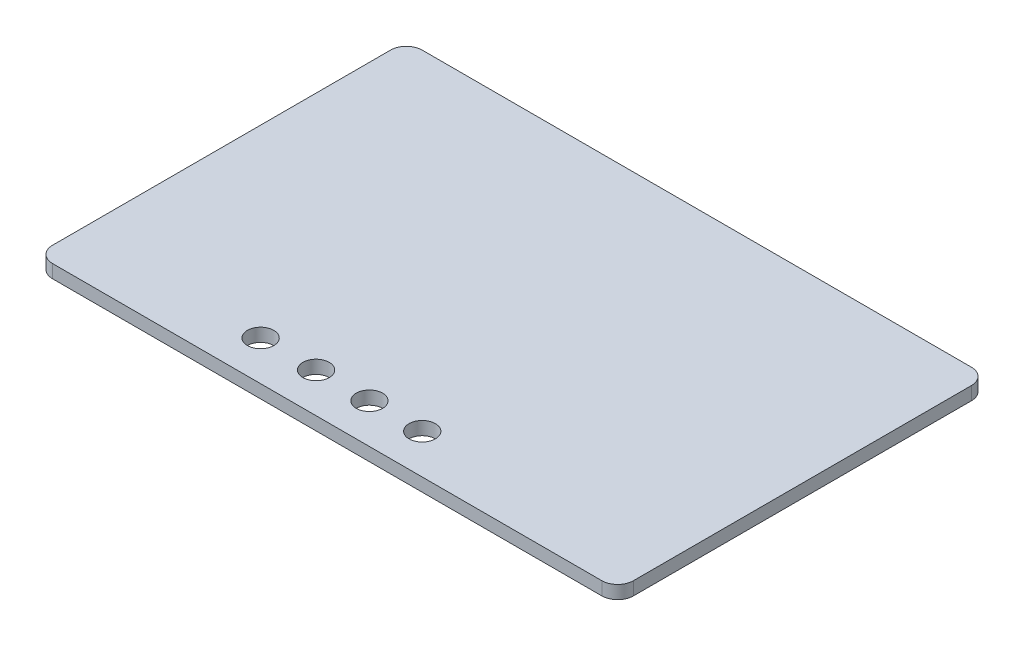
ISO-10303-21;
HEADER;
FILE_DESCRIPTION(('STEP AP214'),'2;1');
FILE_NAME('part.step','',(''),(''),'','','');
FILE_SCHEMA(('AUTOMOTIVE_DESIGN { 1 0 10303 214 1 1 1 1 }'));
ENDSEC;
DATA;
#1=APPLICATION_CONTEXT('core data for automotive mechanical design processes');
#2=APPLICATION_PROTOCOL_DEFINITION('international standard','automotive_design',2000,#1);
#3=PRODUCT_CONTEXT('',#1,'mechanical');
#4=PRODUCT('Part','Part','',(#3));
#5=PRODUCT_RELATED_PRODUCT_CATEGORY('part','',(#4));
#6=PRODUCT_DEFINITION_FORMATION('','',#4);
#7=PRODUCT_DEFINITION_CONTEXT('part definition',#1,'design');
#8=PRODUCT_DEFINITION('design','',#6,#7);
#9=PRODUCT_DEFINITION_SHAPE('','',#8);
#10=(LENGTH_UNIT() NAMED_UNIT(*) SI_UNIT(.MILLI.,.METRE.));
#11=(NAMED_UNIT(*) PLANE_ANGLE_UNIT() SI_UNIT($,.RADIAN.));
#12=(NAMED_UNIT(*) SI_UNIT($,.STERADIAN.) SOLID_ANGLE_UNIT());
#13=UNCERTAINTY_MEASURE_WITH_UNIT(LENGTH_MEASURE(1.E-05),#10,'distance_accuracy_value','');
#14=(GEOMETRIC_REPRESENTATION_CONTEXT(3) GLOBAL_UNCERTAINTY_ASSIGNED_CONTEXT((#13)) GLOBAL_UNIT_ASSIGNED_CONTEXT((#10,
#11,#12)) REPRESENTATION_CONTEXT('',''));
#15=CARTESIAN_POINT('',(0.,0.,0.));
#16=DIRECTION('',(0.,0.,1.));
#17=DIRECTION('',(1.,0.,0.));
#18=AXIS2_PLACEMENT_3D('',#15,#16,#17);
#19=CARTESIAN_POINT('',(-52.,-2.5,32.));
#20=DIRECTION('',(0.,1.,0.));
#21=DIRECTION('',(0.,0.,1.));
#22=AXIS2_PLACEMENT_3D('',#19,#20,#21);
#23=CYLINDRICAL_SURFACE('',#22,3.);
#24=CARTESIAN_POINT('',(-52.,-2.5,32.));
#25=DIRECTION('',(0.,-1.,0.));
#26=DIRECTION('',(0.,0.,-1.));
#27=AXIS2_PLACEMENT_3D('',#24,#25,#26);
#28=CIRCLE('',#27,3.);
#29=CARTESIAN_POINT('',(-55.,-2.5,32.));
#30=VERTEX_POINT('',#29);
#31=CARTESIAN_POINT('',(-52.,-2.5,35.));
#32=VERTEX_POINT('',#31);
#33=EDGE_CURVE('E265',#30,#32,#28,.F.);
#34=ORIENTED_EDGE('',*,*,#33,.T.);
#35=DIRECTION('',(0.,1.,0.));
#36=VECTOR('',#35,1.);
#37=CARTESIAN_POINT('',(-52.,-2.5,35.));
#38=LINE('',#37,#36);
#39=CARTESIAN_POINT('',(-52.,0.,35.));
#40=VERTEX_POINT('',#39);
#41=EDGE_CURVE('E225',#32,#40,#38,.T.);
#42=ORIENTED_EDGE('',*,*,#41,.T.);
#43=CARTESIAN_POINT('',(-52.,0.,32.));
#44=DIRECTION('',(0.,-1.,0.));
#45=DIRECTION('',(0.,0.,-1.));
#46=AXIS2_PLACEMENT_3D('',#43,#44,#45);
#47=CIRCLE('',#46,3.);
#48=CARTESIAN_POINT('',(-55.,0.,32.));
#49=VERTEX_POINT('',#48);
#50=EDGE_CURVE('E283',#40,#49,#47,.T.);
#51=ORIENTED_EDGE('',*,*,#50,.T.);
#52=DIRECTION('',(0.,1.,0.));
#53=VECTOR('',#52,1.);
#54=CARTESIAN_POINT('',(-55.,-2.5,32.));
#55=LINE('',#54,#53);
#56=EDGE_CURVE('E12',#30,#49,#55,.T.);
#57=ORIENTED_EDGE('',*,*,#56,.F.);
#58=EDGE_LOOP('',(#34,#42,#51,#57));
#59=FACE_BOUND('',#58,.T.);
#60=ADVANCED_FACE('F203',(#59),#23,.T.);
#61=CARTESIAN_POINT('',(-55.,-2.5,32.));
#62=DIRECTION('',(1.,0.,0.));
#63=DIRECTION('',(0.,0.,-1.));
#64=AXIS2_PLACEMENT_3D('',#61,#62,#63);
#65=PLANE('',#64);
#66=DIRECTION('',(0.,0.,1.));
#67=VECTOR('',#66,1.);
#68=CARTESIAN_POINT('',(-55.,-2.5,32.));
#69=LINE('',#68,#67);
#70=CARTESIAN_POINT('',(-55.,-2.5,-32.));
#71=VERTEX_POINT('',#70);
#72=EDGE_CURVE('E269',#71,#30,#69,.T.);
#73=ORIENTED_EDGE('',*,*,#72,.T.);
#74=ORIENTED_EDGE('',*,*,#56,.T.);
#75=DIRECTION('',(0.,0.,-1.));
#76=VECTOR('',#75,1.);
#77=CARTESIAN_POINT('',(-55.,0.,32.));
#78=LINE('',#77,#76);
#79=CARTESIAN_POINT('',(-55.,0.,-32.));
#80=VERTEX_POINT('',#79);
#81=EDGE_CURVE('E287',#49,#80,#78,.T.);
#82=ORIENTED_EDGE('',*,*,#81,.T.);
#83=DIRECTION('',(0.,1.,0.));
#84=VECTOR('',#83,1.);
#85=CARTESIAN_POINT('',(-55.,-2.5,-32.));
#86=LINE('',#85,#84);
#87=EDGE_CURVE('E210',#71,#80,#86,.T.);
#88=ORIENTED_EDGE('',*,*,#87,.F.);
#89=EDGE_LOOP('',(#73,#74,#82,#88));
#90=FACE_BOUND('',#89,.T.);
#91=ADVANCED_FACE('F277',(#90),#65,.F.);
#92=CARTESIAN_POINT('',(-52.,-2.5,-32.));
#93=DIRECTION('',(0.,1.,0.));
#94=DIRECTION('',(0.,0.,1.));
#95=AXIS2_PLACEMENT_3D('',#92,#93,#94);
#96=CYLINDRICAL_SURFACE('',#95,3.);
#97=CARTESIAN_POINT('',(-52.,-2.5,-32.));
#98=DIRECTION('',(0.,-1.,0.));
#99=DIRECTION('',(0.,0.,-1.));
#100=AXIS2_PLACEMENT_3D('',#97,#98,#99);
#101=CIRCLE('',#100,3.);
#102=CARTESIAN_POINT('',(-52.,-2.5,-35.));
#103=VERTEX_POINT('',#102);
#104=EDGE_CURVE('E280',#103,#71,#101,.F.);
#105=ORIENTED_EDGE('',*,*,#104,.T.);
#106=ORIENTED_EDGE('',*,*,#87,.T.);
#107=CARTESIAN_POINT('',(-52.,0.,-32.));
#108=DIRECTION('',(0.,-1.,0.));
#109=DIRECTION('',(0.,0.,-1.));
#110=AXIS2_PLACEMENT_3D('',#107,#108,#109);
#111=CIRCLE('',#110,3.);
#112=CARTESIAN_POINT('',(-52.,0.,-35.));
#113=VERTEX_POINT('',#112);
#114=EDGE_CURVE('E290',#80,#113,#111,.T.);
#115=ORIENTED_EDGE('',*,*,#114,.T.);
#116=DIRECTION('',(0.,1.,0.));
#117=VECTOR('',#116,1.);
#118=CARTESIAN_POINT('',(-52.,-2.5,-35.));
#119=LINE('',#118,#117);
#120=EDGE_CURVE('E323',#103,#113,#119,.T.);
#121=ORIENTED_EDGE('',*,*,#120,.F.);
#122=EDGE_LOOP('',(#105,#106,#115,#121));
#123=FACE_BOUND('',#122,.T.);
#124=ADVANCED_FACE('F325',(#123),#96,.T.);
#125=CARTESIAN_POINT('',(-52.,-2.5,-35.));
#126=DIRECTION('',(0.,0.,1.));
#127=DIRECTION('',(1.,0.,0.));
#128=AXIS2_PLACEMENT_3D('',#125,#126,#127);
#129=PLANE('',#128);
#130=DIRECTION('',(-1.,0.,0.));
#131=VECTOR('',#130,1.);
#132=CARTESIAN_POINT('',(-52.,-2.5,-35.));
#133=LINE('',#132,#131);
#134=CARTESIAN_POINT('',(52.,-2.5,-35.));
#135=VERTEX_POINT('',#134);
#136=EDGE_CURVE('E335',#135,#103,#133,.T.);
#137=ORIENTED_EDGE('',*,*,#136,.T.);
#138=ORIENTED_EDGE('',*,*,#120,.T.);
#139=DIRECTION('',(1.,0.,0.));
#140=VECTOR('',#139,1.);
#141=CARTESIAN_POINT('',(-52.,0.,-35.));
#142=LINE('',#141,#140);
#143=CARTESIAN_POINT('',(52.,0.,-35.));
#144=VERTEX_POINT('',#143);
#145=EDGE_CURVE('E300',#113,#144,#142,.T.);
#146=ORIENTED_EDGE('',*,*,#145,.T.);
#147=DIRECTION('',(0.,1.,0.));
#148=VECTOR('',#147,1.);
#149=CARTESIAN_POINT('',(52.,-2.5,-35.));
#150=LINE('',#149,#148);
#151=EDGE_CURVE('E321',#135,#144,#150,.T.);
#152=ORIENTED_EDGE('',*,*,#151,.F.);
#153=EDGE_LOOP('',(#137,#138,#146,#152));
#154=FACE_BOUND('',#153,.T.);
#155=ADVANCED_FACE('F334',(#154),#129,.F.);
#156=CARTESIAN_POINT('',(52.,-2.5,-32.));
#157=DIRECTION('',(0.,1.,0.));
#158=DIRECTION('',(0.,0.,1.));
#159=AXIS2_PLACEMENT_3D('',#156,#157,#158);
#160=CYLINDRICAL_SURFACE('',#159,3.);
#161=CARTESIAN_POINT('',(52.,-2.5,-32.));
#162=DIRECTION('',(0.,-1.,0.));
#163=DIRECTION('',(0.,0.,-1.));
#164=AXIS2_PLACEMENT_3D('',#161,#162,#163);
#165=CIRCLE('',#164,3.);
#166=CARTESIAN_POINT('',(55.,-2.5,-32.));
#167=VERTEX_POINT('',#166);
#168=EDGE_CURVE('E337',#167,#135,#165,.F.);
#169=ORIENTED_EDGE('',*,*,#168,.T.);
#170=ORIENTED_EDGE('',*,*,#151,.T.);
#171=CARTESIAN_POINT('',(52.,0.,-32.));
#172=DIRECTION('',(0.,-1.,0.));
#173=DIRECTION('',(0.,0.,-1.));
#174=AXIS2_PLACEMENT_3D('',#171,#172,#173);
#175=CIRCLE('',#174,3.);
#176=CARTESIAN_POINT('',(55.,0.,-32.));
#177=VERTEX_POINT('',#176);
#178=EDGE_CURVE('E303',#144,#177,#175,.T.);
#179=ORIENTED_EDGE('',*,*,#178,.T.);
#180=DIRECTION('',(0.,1.,0.));
#181=VECTOR('',#180,1.);
#182=CARTESIAN_POINT('',(55.,-2.5,-32.));
#183=LINE('',#182,#181);
#184=EDGE_CURVE('E319',#167,#177,#183,.T.);
#185=ORIENTED_EDGE('',*,*,#184,.F.);
#186=EDGE_LOOP('',(#169,#170,#179,#185));
#187=FACE_BOUND('',#186,.T.);
#188=ADVANCED_FACE('F396',(#187),#160,.T.);
#189=CARTESIAN_POINT('',(55.,-2.5,32.));
#190=DIRECTION('',(1.,0.,0.));
#191=DIRECTION('',(0.,0.,-1.));
#192=AXIS2_PLACEMENT_3D('',#189,#190,#191);
#193=PLANE('',#192);
#194=DIRECTION('',(0.,1.,0.));
#195=VECTOR('',#194,1.);
#196=CARTESIAN_POINT('',(55.,-2.5,32.));
#197=LINE('',#196,#195);
#198=CARTESIAN_POINT('',(55.,-2.5,32.));
#199=VERTEX_POINT('',#198);
#200=CARTESIAN_POINT('',(55.,0.,32.));
#201=VERTEX_POINT('',#200);
#202=EDGE_CURVE('E317',#199,#201,#197,.T.);
#203=ORIENTED_EDGE('',*,*,#202,.F.);
#204=DIRECTION('',(0.,0.,-1.));
#205=VECTOR('',#204,1.);
#206=CARTESIAN_POINT('',(55.,-2.5,-32.));
#207=LINE('',#206,#205);
#208=EDGE_CURVE('E339',#199,#167,#207,.T.);
#209=ORIENTED_EDGE('',*,*,#208,.T.);
#210=ORIENTED_EDGE('',*,*,#184,.T.);
#211=DIRECTION('',(0.,0.,-1.));
#212=VECTOR('',#211,1.);
#213=CARTESIAN_POINT('',(55.,0.,32.));
#214=LINE('',#213,#212);
#215=EDGE_CURVE('E306',#201,#177,#214,.T.);
#216=ORIENTED_EDGE('',*,*,#215,.F.);
#217=EDGE_LOOP('',(#203,#209,#210,#216));
#218=FACE_BOUND('',#217,.T.);
#219=ADVANCED_FACE('F399',(#218),#193,.T.);
#220=CARTESIAN_POINT('',(52.,-2.5,32.));
#221=DIRECTION('',(0.,1.,0.));
#222=DIRECTION('',(0.,0.,1.));
#223=AXIS2_PLACEMENT_3D('',#220,#221,#222);
#224=CYLINDRICAL_SURFACE('',#223,3.);
#225=DIRECTION('',(0.,1.,0.));
#226=VECTOR('',#225,1.);
#227=CARTESIAN_POINT('',(52.,-2.5,35.));
#228=LINE('',#227,#226);
#229=CARTESIAN_POINT('',(52.,-2.5,35.));
#230=VERTEX_POINT('',#229);
#231=CARTESIAN_POINT('',(52.,0.,35.));
#232=VERTEX_POINT('',#231);
#233=EDGE_CURVE('E315',#230,#232,#228,.T.);
#234=ORIENTED_EDGE('',*,*,#233,.F.);
#235=CARTESIAN_POINT('',(52.,-2.5,32.));
#236=DIRECTION('',(0.,-1.,0.));
#237=DIRECTION('',(0.,0.,-1.));
#238=AXIS2_PLACEMENT_3D('',#235,#236,#237);
#239=CIRCLE('',#238,3.);
#240=EDGE_CURVE('E217',#230,#199,#239,.F.);
#241=ORIENTED_EDGE('',*,*,#240,.T.);
#242=ORIENTED_EDGE('',*,*,#202,.T.);
#243=CARTESIAN_POINT('',(52.,0.,32.));
#244=DIRECTION('',(0.,1.,0.));
#245=DIRECTION('',(0.,0.,1.));
#246=AXIS2_PLACEMENT_3D('',#243,#244,#245);
#247=CIRCLE('',#246,3.);
#248=EDGE_CURVE('E309',#232,#201,#247,.T.);
#249=ORIENTED_EDGE('',*,*,#248,.F.);
#250=EDGE_LOOP('',(#234,#241,#242,#249));
#251=FACE_BOUND('',#250,.T.);
#252=ADVANCED_FACE('F379',(#251),#224,.T.);
#253=CARTESIAN_POINT('',(-52.,-2.5,35.));
#254=DIRECTION('',(0.,0.,1.));
#255=DIRECTION('',(1.,0.,0.));
#256=AXIS2_PLACEMENT_3D('',#253,#254,#255);
#257=PLANE('',#256);
#258=ORIENTED_EDGE('',*,*,#41,.F.);
#259=DIRECTION('',(1.,0.,0.));
#260=VECTOR('',#259,1.);
#261=CARTESIAN_POINT('',(52.,-2.5,35.));
#262=LINE('',#261,#260);
#263=EDGE_CURVE('E271',#32,#230,#262,.T.);
#264=ORIENTED_EDGE('',*,*,#263,.T.);
#265=ORIENTED_EDGE('',*,*,#233,.T.);
#266=DIRECTION('',(1.,0.,0.));
#267=VECTOR('',#266,1.);
#268=CARTESIAN_POINT('',(-52.,0.,35.));
#269=LINE('',#268,#267);
#270=EDGE_CURVE('E312',#40,#232,#269,.T.);
#271=ORIENTED_EDGE('',*,*,#270,.F.);
#272=EDGE_LOOP('',(#258,#264,#265,#271));
#273=FACE_BOUND('',#272,.T.);
#274=ADVANCED_FACE('F369',(#273),#257,.T.);
#275=CARTESIAN_POINT('',(-52.,0.,32.));
#276=DIRECTION('',(0.,-1.,0.));
#277=DIRECTION('',(0.,0.,-1.));
#278=AXIS2_PLACEMENT_3D('',#275,#276,#277);
#279=PLANE('',#278);
#280=CARTESIAN_POINT('',(-20.1,0.,27.5));
#281=DIRECTION('',(0.,1.,0.));
#282=DIRECTION('',(0.,0.,1.));
#283=AXIS2_PLACEMENT_3D('',#280,#281,#282);
#284=CIRCLE('',#283,2.49999999999999);
#285=CARTESIAN_POINT('',(-20.1,0.,30.));
#286=VERTEX_POINT('',#285);
#287=EDGE_CURVE('E288',#286,#286,#284,.T.);
#288=ORIENTED_EDGE('',*,*,#287,.F.);
#289=EDGE_LOOP('',(#288));
#290=FACE_BOUND('',#289,.T.);
#291=CARTESIAN_POINT('',(-9.60000000000001,0.,27.5));
#292=DIRECTION('',(0.,1.,0.));
#293=DIRECTION('',(0.,0.,1.));
#294=AXIS2_PLACEMENT_3D('',#291,#292,#293);
#295=CIRCLE('',#294,2.49999999999999);
#296=CARTESIAN_POINT('',(-9.60000000000001,0.,30.));
#297=VERTEX_POINT('',#296);
#298=EDGE_CURVE('E352',#297,#297,#295,.T.);
#299=ORIENTED_EDGE('',*,*,#298,.F.);
#300=EDGE_LOOP('',(#299));
#301=FACE_BOUND('',#300,.T.);
#302=CARTESIAN_POINT('',(0.499999999999994,0.,27.5));
#303=DIRECTION('',(0.,1.,0.));
#304=DIRECTION('',(0.,0.,1.));
#305=AXIS2_PLACEMENT_3D('',#302,#303,#304);
#306=CIRCLE('',#305,2.5);
#307=CARTESIAN_POINT('',(0.499999999999994,0.,30.));
#308=VERTEX_POINT('',#307);
#309=EDGE_CURVE('E358',#308,#308,#306,.T.);
#310=ORIENTED_EDGE('',*,*,#309,.F.);
#311=EDGE_LOOP('',(#310));
#312=FACE_BOUND('',#311,.T.);
#313=CARTESIAN_POINT('',(10.5,0.,27.5));
#314=DIRECTION('',(0.,1.,0.));
#315=DIRECTION('',(0.,0.,1.));
#316=AXIS2_PLACEMENT_3D('',#313,#314,#315);
#317=CIRCLE('',#316,2.5);
#318=CARTESIAN_POINT('',(10.5,0.,30.));
#319=VERTEX_POINT('',#318);
#320=EDGE_CURVE('E273',#319,#319,#317,.T.);
#321=ORIENTED_EDGE('',*,*,#320,.F.);
#322=EDGE_LOOP('',(#321));
#323=FACE_BOUND('',#322,.T.);
#324=ORIENTED_EDGE('',*,*,#50,.F.);
#325=ORIENTED_EDGE('',*,*,#270,.T.);
#326=ORIENTED_EDGE('',*,*,#248,.T.);
#327=ORIENTED_EDGE('',*,*,#215,.T.);
#328=ORIENTED_EDGE('',*,*,#178,.F.);
#329=ORIENTED_EDGE('',*,*,#145,.F.);
#330=ORIENTED_EDGE('',*,*,#114,.F.);
#331=ORIENTED_EDGE('',*,*,#81,.F.);
#332=EDGE_LOOP('',(#324,#325,#326,#327,#328,#329,#330,#331));
#333=FACE_BOUND('',#332,.T.);
#334=ADVANCED_FACE('F329',(#290,#301,#312,#323,#333),#279,.F.);
#335=CARTESIAN_POINT('',(10.5,-27.001,27.5));
#336=DIRECTION('',(0.,1.,0.));
#337=DIRECTION('',(0.,0.,1.));
#338=AXIS2_PLACEMENT_3D('',#335,#336,#337);
#339=CYLINDRICAL_SURFACE('',#338,2.5);
#340=CARTESIAN_POINT('',(10.5,-2.5,27.5));
#341=DIRECTION('',(0.,-1.,0.));
#342=DIRECTION('',(0.,0.,-1.));
#343=AXIS2_PLACEMENT_3D('',#340,#341,#342);
#344=CIRCLE('',#343,2.5);
#345=CARTESIAN_POINT('',(10.5,-2.5,25.));
#346=VERTEX_POINT('',#345);
#347=EDGE_CURVE('E360',#346,#346,#344,.F.);
#348=ORIENTED_EDGE('',*,*,#347,.F.);
#349=EDGE_LOOP('',(#348));
#350=FACE_BOUND('',#349,.T.);
#351=ORIENTED_EDGE('',*,*,#320,.T.);
#352=EDGE_LOOP('',(#351));
#353=FACE_BOUND('',#352,.T.);
#354=ADVANCED_FACE('F366',(#350,#353),#339,.F.);
#355=CARTESIAN_POINT('',(0.499999999999994,-27.001,27.5));
#356=DIRECTION('',(0.,1.,0.));
#357=DIRECTION('',(0.,0.,1.));
#358=AXIS2_PLACEMENT_3D('',#355,#356,#357);
#359=CYLINDRICAL_SURFACE('',#358,2.5);
#360=CARTESIAN_POINT('',(0.499999999999994,-2.5,27.5));
#361=DIRECTION('',(0.,-1.,0.));
#362=DIRECTION('',(0.,0.,-1.));
#363=AXIS2_PLACEMENT_3D('',#360,#361,#362);
#364=CIRCLE('',#363,2.5);
#365=CARTESIAN_POINT('',(0.499999999999994,-2.5,25.));
#366=VERTEX_POINT('',#365);
#367=EDGE_CURVE('E355',#366,#366,#364,.F.);
#368=ORIENTED_EDGE('',*,*,#367,.F.);
#369=EDGE_LOOP('',(#368));
#370=FACE_BOUND('',#369,.T.);
#371=ORIENTED_EDGE('',*,*,#309,.T.);
#372=EDGE_LOOP('',(#371));
#373=FACE_BOUND('',#372,.T.);
#374=ADVANCED_FACE('F376',(#370,#373),#359,.F.);
#375=CARTESIAN_POINT('',(-9.60000000000001,-27.001,27.5));
#376=DIRECTION('',(0.,1.,0.));
#377=DIRECTION('',(0.,0.,1.));
#378=AXIS2_PLACEMENT_3D('',#375,#376,#377);
#379=CYLINDRICAL_SURFACE('',#378,2.49999999999999);
#380=CARTESIAN_POINT('',(-9.60000000000001,-2.5,27.5));
#381=DIRECTION('',(0.,-1.,0.));
#382=DIRECTION('',(0.,0.,-1.));
#383=AXIS2_PLACEMENT_3D('',#380,#381,#382);
#384=CIRCLE('',#383,2.49999999999999);
#385=CARTESIAN_POINT('',(-9.60000000000001,-2.5,25.));
#386=VERTEX_POINT('',#385);
#387=EDGE_CURVE('E349',#386,#386,#384,.F.);
#388=ORIENTED_EDGE('',*,*,#387,.F.);
#389=EDGE_LOOP('',(#388));
#390=FACE_BOUND('',#389,.T.);
#391=ORIENTED_EDGE('',*,*,#298,.T.);
#392=EDGE_LOOP('',(#391));
#393=FACE_BOUND('',#392,.T.);
#394=ADVANCED_FACE('F565',(#390,#393),#379,.F.);
#395=CARTESIAN_POINT('',(-20.1,-27.001,27.5));
#396=DIRECTION('',(0.,1.,0.));
#397=DIRECTION('',(0.,0.,1.));
#398=AXIS2_PLACEMENT_3D('',#395,#396,#397);
#399=CYLINDRICAL_SURFACE('',#398,2.49999999999999);
#400=CARTESIAN_POINT('',(-20.1,-2.5,27.5));
#401=DIRECTION('',(0.,-1.,0.));
#402=DIRECTION('',(0.,0.,-1.));
#403=AXIS2_PLACEMENT_3D('',#400,#401,#402);
#404=CIRCLE('',#403,2.49999999999999);
#405=CARTESIAN_POINT('',(-20.1,-2.5,25.));
#406=VERTEX_POINT('',#405);
#407=EDGE_CURVE('E293',#406,#406,#404,.F.);
#408=ORIENTED_EDGE('',*,*,#407,.F.);
#409=EDGE_LOOP('',(#408));
#410=FACE_BOUND('',#409,.T.);
#411=ORIENTED_EDGE('',*,*,#287,.T.);
#412=EDGE_LOOP('',(#411));
#413=FACE_BOUND('',#412,.T.);
#414=ADVANCED_FACE('F436',(#410,#413),#399,.F.);
#415=CARTESIAN_POINT('',(-52.,-2.5,32.));
#416=DIRECTION('',(0.,-1.,0.));
#417=DIRECTION('',(0.,0.,-1.));
#418=AXIS2_PLACEMENT_3D('',#415,#416,#417);
#419=PLANE('',#418);
#420=CARTESIAN_POINT('',(24.5,-2.5,27.5));
#421=DIRECTION('',(0.,-1.,0.));
#422=DIRECTION('',(0.,0.,-1.));
#423=AXIS2_PLACEMENT_3D('',#420,#421,#422);
#424=CIRCLE('',#423,1.4);
#425=CARTESIAN_POINT('',(24.5,-2.5,26.1));
#426=VERTEX_POINT('',#425);
#427=EDGE_CURVE('E681',#426,#426,#424,.T.);
#428=ORIENTED_EDGE('',*,*,#427,.F.);
#429=EDGE_LOOP('',(#428));
#430=FACE_BOUND('',#429,.T.);
#431=CARTESIAN_POINT('',(45.5,-2.5,27.5));
#432=DIRECTION('',(0.,-1.,0.));
#433=DIRECTION('',(0.,0.,-1.));
#434=AXIS2_PLACEMENT_3D('',#431,#432,#433);
#435=CIRCLE('',#434,1.4);
#436=CARTESIAN_POINT('',(45.5,-2.5,26.1));
#437=VERTEX_POINT('',#436);
#438=EDGE_CURVE('E680',#437,#437,#435,.T.);
#439=ORIENTED_EDGE('',*,*,#438,.F.);
#440=EDGE_LOOP('',(#439));
#441=FACE_BOUND('',#440,.T.);
#442=CARTESIAN_POINT('',(45.5,-2.5,-27.5));
#443=DIRECTION('',(0.,-1.,0.));
#444=DIRECTION('',(0.,0.,-1.));
#445=AXIS2_PLACEMENT_3D('',#442,#443,#444);
#446=CIRCLE('',#445,1.4);
#447=CARTESIAN_POINT('',(45.5,-2.5,-28.9));
#448=VERTEX_POINT('',#447);
#449=EDGE_CURVE('E690',#448,#448,#446,.T.);
#450=ORIENTED_EDGE('',*,*,#449,.F.);
#451=EDGE_LOOP('',(#450));
#452=FACE_BOUND('',#451,.T.);
#453=CARTESIAN_POINT('',(24.5,-2.5,-27.5));
#454=DIRECTION('',(0.,-1.,0.));
#455=DIRECTION('',(0.,0.,-1.));
#456=AXIS2_PLACEMENT_3D('',#453,#454,#455);
#457=CIRCLE('',#456,1.4);
#458=CARTESIAN_POINT('',(24.5,-2.5,-28.9));
#459=VERTEX_POINT('',#458);
#460=EDGE_CURVE('E695',#459,#459,#457,.T.);
#461=ORIENTED_EDGE('',*,*,#460,.F.);
#462=EDGE_LOOP('',(#461));
#463=FACE_BOUND('',#462,.T.);
#464=CARTESIAN_POINT('',(-45.5,-2.5,-27.5));
#465=DIRECTION('',(0.,-1.,0.));
#466=DIRECTION('',(0.,0.,-1.));
#467=AXIS2_PLACEMENT_3D('',#464,#465,#466);
#468=CIRCLE('',#467,1.4);
#469=CARTESIAN_POINT('',(-45.5,-2.5,-28.9));
#470=VERTEX_POINT('',#469);
#471=EDGE_CURVE('E701',#470,#470,#468,.T.);
#472=ORIENTED_EDGE('',*,*,#471,.F.);
#473=EDGE_LOOP('',(#472));
#474=FACE_BOUND('',#473,.T.);
#475=CARTESIAN_POINT('',(-45.5,-2.5,27.5));
#476=DIRECTION('',(0.,-1.,0.));
#477=DIRECTION('',(0.,0.,-1.));
#478=AXIS2_PLACEMENT_3D('',#475,#476,#477);
#479=CIRCLE('',#478,1.4);
#480=CARTESIAN_POINT('',(-45.5,-2.5,26.1));
#481=VERTEX_POINT('',#480);
#482=EDGE_CURVE('E707',#481,#481,#479,.T.);
#483=ORIENTED_EDGE('',*,*,#482,.F.);
#484=EDGE_LOOP('',(#483));
#485=FACE_BOUND('',#484,.T.);
#486=ORIENTED_EDGE('',*,*,#263,.F.);
#487=ORIENTED_EDGE('',*,*,#33,.F.);
#488=ORIENTED_EDGE('',*,*,#72,.F.);
#489=ORIENTED_EDGE('',*,*,#104,.F.);
#490=ORIENTED_EDGE('',*,*,#136,.F.);
#491=ORIENTED_EDGE('',*,*,#168,.F.);
#492=ORIENTED_EDGE('',*,*,#208,.F.);
#493=ORIENTED_EDGE('',*,*,#240,.F.);
#494=EDGE_LOOP('',(#486,#487,#488,#489,#490,#491,#492,#493));
#495=FACE_BOUND('',#494,.T.);
#496=ORIENTED_EDGE('',*,*,#347,.T.);
#497=EDGE_LOOP('',(#496));
#498=FACE_BOUND('',#497,.T.);
#499=ORIENTED_EDGE('',*,*,#367,.T.);
#500=EDGE_LOOP('',(#499));
#501=FACE_BOUND('',#500,.T.);
#502=ORIENTED_EDGE('',*,*,#387,.T.);
#503=EDGE_LOOP('',(#502));
#504=FACE_BOUND('',#503,.T.);
#505=ORIENTED_EDGE('',*,*,#407,.T.);
#506=EDGE_LOOP('',(#505));
#507=FACE_BOUND('',#506,.T.);
#508=ADVANCED_FACE('F267',(#430,#441,#452,#463,#474,#485,#495,#498,#501,#504,#507),#419,.T.);
#509=CARTESIAN_POINT('',(-45.5,-7.5,27.5));
#510=DIRECTION('',(0.,1.,0.));
#511=DIRECTION('',(0.,0.,1.));
#512=AXIS2_PLACEMENT_3D('',#509,#510,#511);
#513=CYLINDRICAL_SURFACE('',#512,1.4);
#514=CARTESIAN_POINT('',(-45.5,-7.5,27.5));
#515=DIRECTION('',(0.,-1.,0.));
#516=DIRECTION('',(0.,0.,-1.));
#517=AXIS2_PLACEMENT_3D('',#514,#515,#516);
#518=CIRCLE('',#517,1.4);
#519=CARTESIAN_POINT('',(-45.5,-7.5,26.1));
#520=VERTEX_POINT('',#519);
#521=EDGE_CURVE('E281',#520,#520,#518,.T.);
#522=ORIENTED_EDGE('',*,*,#521,.F.);
#523=EDGE_LOOP('',(#522));
#524=FACE_BOUND('',#523,.T.);
#525=ORIENTED_EDGE('',*,*,#482,.T.);
#526=EDGE_LOOP('',(#525));
#527=FACE_BOUND('',#526,.T.);
#528=ADVANCED_FACE('F435',(#524,#527),#513,.T.);
#529=CARTESIAN_POINT('',(-45.5,-7.5,27.5));
#530=DIRECTION('',(0.,-1.,0.));
#531=DIRECTION('',(0.,0.,-1.));
#532=AXIS2_PLACEMENT_3D('',#529,#530,#531);
#533=PLANE('',#532);
#534=ORIENTED_EDGE('',*,*,#521,.T.);
#535=EDGE_LOOP('',(#534));
#536=FACE_BOUND('',#535,.T.);
#537=ADVANCED_FACE('F448',(#536),#533,.T.);
#538=CARTESIAN_POINT('',(-45.5,-7.5,-27.5));
#539=DIRECTION('',(0.,1.,0.));
#540=DIRECTION('',(0.,0.,1.));
#541=AXIS2_PLACEMENT_3D('',#538,#539,#540);
#542=CYLINDRICAL_SURFACE('',#541,1.4);
#543=CARTESIAN_POINT('',(-45.5,-7.5,-27.5));
#544=DIRECTION('',(0.,-1.,0.));
#545=DIRECTION('',(0.,0.,-1.));
#546=AXIS2_PLACEMENT_3D('',#543,#544,#545);
#547=CIRCLE('',#546,1.4);
#548=CARTESIAN_POINT('',(-45.5,-7.5,-28.9));
#549=VERTEX_POINT('',#548);
#550=EDGE_CURVE('E704',#549,#549,#547,.T.);
#551=ORIENTED_EDGE('',*,*,#550,.F.);
#552=EDGE_LOOP('',(#551));
#553=FACE_BOUND('',#552,.T.);
#554=ORIENTED_EDGE('',*,*,#471,.T.);
#555=EDGE_LOOP('',(#554));
#556=FACE_BOUND('',#555,.T.);
#557=ADVANCED_FACE('F458',(#553,#556),#542,.T.);
#558=CARTESIAN_POINT('',(-45.5,-7.5,-27.5));
#559=DIRECTION('',(0.,-1.,0.));
#560=DIRECTION('',(0.,0.,-1.));
#561=AXIS2_PLACEMENT_3D('',#558,#559,#560);
#562=PLANE('',#561);
#563=ORIENTED_EDGE('',*,*,#550,.T.);
#564=EDGE_LOOP('',(#563));
#565=FACE_BOUND('',#564,.T.);
#566=ADVANCED_FACE('F468',(#565),#562,.T.);
#567=CARTESIAN_POINT('',(24.5,-7.5,-27.5));
#568=DIRECTION('',(0.,1.,0.));
#569=DIRECTION('',(0.,0.,1.));
#570=AXIS2_PLACEMENT_3D('',#567,#568,#569);
#571=CYLINDRICAL_SURFACE('',#570,1.4);
#572=CARTESIAN_POINT('',(24.5,-7.5,-27.5));
#573=DIRECTION('',(0.,-1.,0.));
#574=DIRECTION('',(0.,0.,-1.));
#575=AXIS2_PLACEMENT_3D('',#572,#573,#574);
#576=CIRCLE('',#575,1.4);
#577=CARTESIAN_POINT('',(24.5,-7.5,-28.9));
#578=VERTEX_POINT('',#577);
#579=EDGE_CURVE('E698',#578,#578,#576,.T.);
#580=ORIENTED_EDGE('',*,*,#579,.F.);
#581=EDGE_LOOP('',(#580));
#582=FACE_BOUND('',#581,.T.);
#583=ORIENTED_EDGE('',*,*,#460,.T.);
#584=EDGE_LOOP('',(#583));
#585=FACE_BOUND('',#584,.T.);
#586=ADVANCED_FACE('F478',(#582,#585),#571,.T.);
#587=CARTESIAN_POINT('',(24.5,-7.5,-27.5));
#588=DIRECTION('',(0.,-1.,0.));
#589=DIRECTION('',(0.,0.,-1.));
#590=AXIS2_PLACEMENT_3D('',#587,#588,#589);
#591=PLANE('',#590);
#592=ORIENTED_EDGE('',*,*,#579,.T.);
#593=EDGE_LOOP('',(#592));
#594=FACE_BOUND('',#593,.T.);
#595=ADVANCED_FACE('F488',(#594),#591,.T.);
#596=CARTESIAN_POINT('',(45.5,-7.5,-27.5));
#597=DIRECTION('',(0.,1.,0.));
#598=DIRECTION('',(0.,0.,1.));
#599=AXIS2_PLACEMENT_3D('',#596,#597,#598);
#600=CYLINDRICAL_SURFACE('',#599,1.4);
#601=CARTESIAN_POINT('',(45.5,-7.5,-27.5));
#602=DIRECTION('',(0.,-1.,0.));
#603=DIRECTION('',(0.,0.,-1.));
#604=AXIS2_PLACEMENT_3D('',#601,#602,#603);
#605=CIRCLE('',#604,1.4);
#606=CARTESIAN_POINT('',(45.5,-7.5,-28.9));
#607=VERTEX_POINT('',#606);
#608=EDGE_CURVE('E692',#607,#607,#605,.T.);
#609=ORIENTED_EDGE('',*,*,#608,.F.);
#610=EDGE_LOOP('',(#609));
#611=FACE_BOUND('',#610,.T.);
#612=ORIENTED_EDGE('',*,*,#449,.T.);
#613=EDGE_LOOP('',(#612));
#614=FACE_BOUND('',#613,.T.);
#615=ADVANCED_FACE('F498',(#611,#614),#600,.T.);
#616=CARTESIAN_POINT('',(45.5,-7.5,-27.5));
#617=DIRECTION('',(0.,-1.,0.));
#618=DIRECTION('',(0.,0.,-1.));
#619=AXIS2_PLACEMENT_3D('',#616,#617,#618);
#620=PLANE('',#619);
#621=ORIENTED_EDGE('',*,*,#608,.T.);
#622=EDGE_LOOP('',(#621));
#623=FACE_BOUND('',#622,.T.);
#624=ADVANCED_FACE('F508',(#623),#620,.T.);
#625=CARTESIAN_POINT('',(45.5,-7.5,27.5));
#626=DIRECTION('',(0.,1.,0.));
#627=DIRECTION('',(0.,0.,1.));
#628=AXIS2_PLACEMENT_3D('',#625,#626,#627);
#629=CYLINDRICAL_SURFACE('',#628,1.4);
#630=CARTESIAN_POINT('',(45.5,-7.5,27.5));
#631=DIRECTION('',(0.,-1.,0.));
#632=DIRECTION('',(0.,0.,-1.));
#633=AXIS2_PLACEMENT_3D('',#630,#631,#632);
#634=CIRCLE('',#633,1.4);
#635=CARTESIAN_POINT('',(45.5,-7.5,26.1));
#636=VERTEX_POINT('',#635);
#637=EDGE_CURVE('E684',#636,#636,#634,.T.);
#638=ORIENTED_EDGE('',*,*,#637,.F.);
#639=EDGE_LOOP('',(#638));
#640=FACE_BOUND('',#639,.T.);
#641=ORIENTED_EDGE('',*,*,#438,.T.);
#642=EDGE_LOOP('',(#641));
#643=FACE_BOUND('',#642,.T.);
#644=ADVANCED_FACE('F518',(#640,#643),#629,.T.);
#645=CARTESIAN_POINT('',(45.5,-7.5,27.5));
#646=DIRECTION('',(0.,-1.,0.));
#647=DIRECTION('',(0.,0.,-1.));
#648=AXIS2_PLACEMENT_3D('',#645,#646,#647);
#649=PLANE('',#648);
#650=ORIENTED_EDGE('',*,*,#637,.T.);
#651=EDGE_LOOP('',(#650));
#652=FACE_BOUND('',#651,.T.);
#653=ADVANCED_FACE('F528',(#652),#649,.T.);
#654=CARTESIAN_POINT('',(24.5,-7.5,27.5));
#655=DIRECTION('',(0.,1.,0.));
#656=DIRECTION('',(0.,0.,1.));
#657=AXIS2_PLACEMENT_3D('',#654,#655,#656);
#658=CYLINDRICAL_SURFACE('',#657,1.4);
#659=CARTESIAN_POINT('',(24.5,-7.5,27.5));
#660=DIRECTION('',(0.,-1.,0.));
#661=DIRECTION('',(0.,0.,-1.));
#662=AXIS2_PLACEMENT_3D('',#659,#660,#661);
#663=CIRCLE('',#662,1.4);
#664=CARTESIAN_POINT('',(24.5,-7.5,26.1));
#665=VERTEX_POINT('',#664);
#666=EDGE_CURVE('E679',#665,#665,#663,.T.);
#667=ORIENTED_EDGE('',*,*,#666,.F.);
#668=EDGE_LOOP('',(#667));
#669=FACE_BOUND('',#668,.T.);
#670=ORIENTED_EDGE('',*,*,#427,.T.);
#671=EDGE_LOOP('',(#670));
#672=FACE_BOUND('',#671,.T.);
#673=ADVANCED_FACE('F538',(#669,#672),#658,.T.);
#674=CARTESIAN_POINT('',(24.5,-7.5,27.5));
#675=DIRECTION('',(0.,-1.,0.));
#676=DIRECTION('',(0.,0.,-1.));
#677=AXIS2_PLACEMENT_3D('',#674,#675,#676);
#678=PLANE('',#677);
#679=ORIENTED_EDGE('',*,*,#666,.T.);
#680=EDGE_LOOP('',(#679));
#681=FACE_BOUND('',#680,.T.);
#682=ADVANCED_FACE('F548',(#681),#678,.T.);
#683=CLOSED_SHELL('',(#60,#91,#124,#155,#188,#219,#252,#274,#334,#354,#374,#394,#414,#508,#528,
#537,#557,#566,#586,#595,#615,#624,#644,#653,#673,#682));
#684=MANIFOLD_SOLID_BREP('B2',#683);
#685=ADVANCED_BREP_SHAPE_REPRESENTATION('',(#18,#684),#14);
#686=SHAPE_DEFINITION_REPRESENTATION(#9,#685);
ENDSEC;
END-ISO-10303-21;
